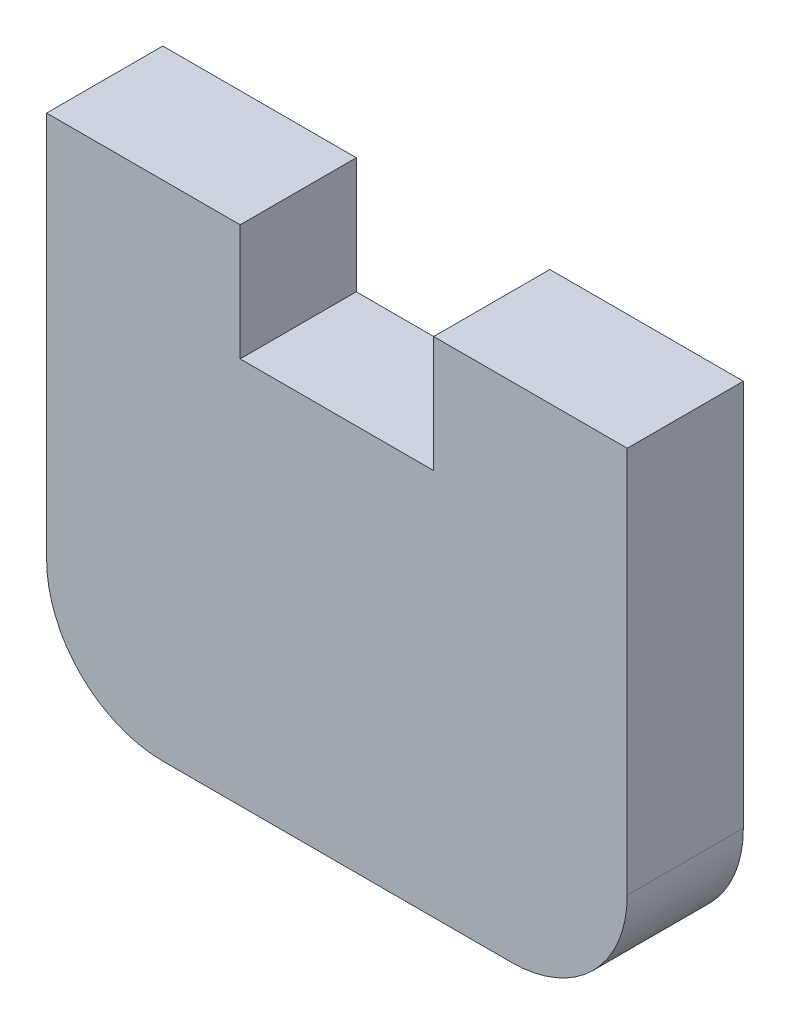
ISO-10303-21;
HEADER;
FILE_DESCRIPTION(('STEP AP214'),'2;1');
FILE_NAME('part.step','',(''),(''),'','','');
FILE_SCHEMA(('AUTOMOTIVE_DESIGN { 1 0 10303 214 1 1 1 1 }'));
ENDSEC;
DATA;
#1=APPLICATION_CONTEXT('core data for automotive mechanical design processes');
#2=APPLICATION_PROTOCOL_DEFINITION('international standard','automotive_design',2000,#1);
#3=PRODUCT_CONTEXT('',#1,'mechanical');
#4=PRODUCT('Part','Part','',(#3));
#5=PRODUCT_RELATED_PRODUCT_CATEGORY('part','',(#4));
#6=PRODUCT_DEFINITION_FORMATION('','',#4);
#7=PRODUCT_DEFINITION_CONTEXT('part definition',#1,'design');
#8=PRODUCT_DEFINITION('design','',#6,#7);
#9=PRODUCT_DEFINITION_SHAPE('','',#8);
#10=(LENGTH_UNIT() NAMED_UNIT(*) SI_UNIT(.MILLI.,.METRE.));
#11=(NAMED_UNIT(*) PLANE_ANGLE_UNIT() SI_UNIT($,.RADIAN.));
#12=(NAMED_UNIT(*) SI_UNIT($,.STERADIAN.) SOLID_ANGLE_UNIT());
#13=UNCERTAINTY_MEASURE_WITH_UNIT(LENGTH_MEASURE(1.E-05),#10,'distance_accuracy_value','');
#14=(GEOMETRIC_REPRESENTATION_CONTEXT(3) GLOBAL_UNCERTAINTY_ASSIGNED_CONTEXT((#13)) GLOBAL_UNIT_ASSIGNED_CONTEXT((#10,
#11,#12)) REPRESENTATION_CONTEXT('',''));
#15=CARTESIAN_POINT('',(0.,0.,0.));
#16=DIRECTION('',(0.,0.,1.));
#17=DIRECTION('',(1.,0.,0.));
#18=AXIS2_PLACEMENT_3D('',#15,#16,#17);
#19=CARTESIAN_POINT('',(-2.,12.0010272230946,3.));
#20=DIRECTION('',(0.,0.,-1.));
#21=DIRECTION('',(-1.,0.,0.));
#22=AXIS2_PLACEMENT_3D('',#19,#20,#21);
#23=CYLINDRICAL_SURFACE('',#22,3.);
#24=CARTESIAN_POINT('',(-2.,12.0010272230946,0.));
#25=DIRECTION('',(0.,0.,1.));
#26=DIRECTION('',(1.,0.,0.));
#27=AXIS2_PLACEMENT_3D('',#24,#25,#26);
#28=CIRCLE('',#27,3.);
#29=CARTESIAN_POINT('',(-5.,12.0010272230946,0.));
#30=VERTEX_POINT('',#29);
#31=CARTESIAN_POINT('',(-1.99999999999998,9.00102722309465,0.));
#32=VERTEX_POINT('',#31);
#33=EDGE_CURVE('E141',#30,#32,#28,.T.);
#34=ORIENTED_EDGE('',*,*,#33,.T.);
#35=DIRECTION('',(0.,0.,-1.));
#36=VECTOR('',#35,1.);
#37=CARTESIAN_POINT('',(-1.99999999999998,9.00102722309465,3.));
#38=LINE('',#37,#36);
#39=CARTESIAN_POINT('',(-1.99999999999998,9.00102722309465,3.));
#40=VERTEX_POINT('',#39);
#41=EDGE_CURVE('E11',#40,#32,#38,.T.);
#42=ORIENTED_EDGE('',*,*,#41,.F.);
#43=CARTESIAN_POINT('',(-2.,12.0010272230946,3.));
#44=DIRECTION('',(0.,0.,1.));
#45=DIRECTION('',(1.,0.,0.));
#46=AXIS2_PLACEMENT_3D('',#43,#44,#45);
#47=CIRCLE('',#46,3.);
#48=CARTESIAN_POINT('',(-5.,12.0010272230946,3.));
#49=VERTEX_POINT('',#48);
#50=EDGE_CURVE('E160',#49,#40,#47,.T.);
#51=ORIENTED_EDGE('',*,*,#50,.F.);
#52=DIRECTION('',(0.,0.,-1.));
#53=VECTOR('',#52,1.);
#54=CARTESIAN_POINT('',(-5.,12.0010272230946,3.));
#55=LINE('',#54,#53);
#56=EDGE_CURVE('E137',#49,#30,#55,.T.);
#57=ORIENTED_EDGE('',*,*,#56,.T.);
#58=EDGE_LOOP('',(#34,#42,#51,#57));
#59=FACE_BOUND('',#58,.T.);
#60=ADVANCED_FACE('F33',(#59),#23,.T.);
#61=CARTESIAN_POINT('',(6.99999999999999,9.00102722309465,3.));
#62=DIRECTION('',(0.,1.,0.));
#63=DIRECTION('',(0.,0.,1.));
#64=AXIS2_PLACEMENT_3D('',#61,#62,#63);
#65=PLANE('',#64);
#66=DIRECTION('',(1.,0.,0.));
#67=VECTOR('',#66,1.);
#68=CARTESIAN_POINT('',(6.99999999999999,9.00102722309465,0.));
#69=LINE('',#68,#67);
#70=CARTESIAN_POINT('',(6.99999999999999,9.00102722309464,0.));
#71=VERTEX_POINT('',#70);
#72=EDGE_CURVE('E144',#32,#71,#69,.T.);
#73=ORIENTED_EDGE('',*,*,#72,.T.);
#74=DIRECTION('',(0.,0.,-1.));
#75=VECTOR('',#74,1.);
#76=CARTESIAN_POINT('',(6.99999999999999,9.00102722309464,3.));
#77=LINE('',#76,#75);
#78=CARTESIAN_POINT('',(6.99999999999999,9.00102722309464,3.));
#79=VERTEX_POINT('',#78);
#80=EDGE_CURVE('E41',#79,#71,#77,.T.);
#81=ORIENTED_EDGE('',*,*,#80,.F.);
#82=DIRECTION('',(1.,0.,0.));
#83=VECTOR('',#82,1.);
#84=CARTESIAN_POINT('',(6.99999999999999,9.00102722309465,3.));
#85=LINE('',#84,#83);
#86=EDGE_CURVE('E98',#40,#79,#85,.T.);
#87=ORIENTED_EDGE('',*,*,#86,.F.);
#88=ORIENTED_EDGE('',*,*,#41,.T.);
#89=EDGE_LOOP('',(#73,#81,#87,#88));
#90=FACE_BOUND('',#89,.T.);
#91=ADVANCED_FACE('F208',(#90),#65,.F.);
#92=CARTESIAN_POINT('',(6.99999999999999,12.0010272230946,3.));
#93=DIRECTION('',(0.,0.,-1.));
#94=DIRECTION('',(-1.,0.,0.));
#95=AXIS2_PLACEMENT_3D('',#92,#93,#94);
#96=CYLINDRICAL_SURFACE('',#95,3.);
#97=CARTESIAN_POINT('',(6.99999999999999,12.0010272230946,0.));
#98=DIRECTION('',(0.,0.,1.));
#99=DIRECTION('',(-1.,0.,0.));
#100=AXIS2_PLACEMENT_3D('',#97,#98,#99);
#101=CIRCLE('',#100,3.);
#102=CARTESIAN_POINT('',(9.99999999999999,12.0010272230946,0.));
#103=VERTEX_POINT('',#102);
#104=EDGE_CURVE('E146',#71,#103,#101,.T.);
#105=ORIENTED_EDGE('',*,*,#104,.T.);
#106=DIRECTION('',(0.,0.,-1.));
#107=VECTOR('',#106,1.);
#108=CARTESIAN_POINT('',(9.99999999999999,12.0010272230946,3.));
#109=LINE('',#108,#107);
#110=CARTESIAN_POINT('',(9.99999999999999,12.0010272230946,3.));
#111=VERTEX_POINT('',#110);
#112=EDGE_CURVE('E173',#111,#103,#109,.T.);
#113=ORIENTED_EDGE('',*,*,#112,.F.);
#114=CARTESIAN_POINT('',(6.99999999999999,12.0010272230946,3.));
#115=DIRECTION('',(0.,0.,1.));
#116=DIRECTION('',(-1.,0.,0.));
#117=AXIS2_PLACEMENT_3D('',#114,#115,#116);
#118=CIRCLE('',#117,3.);
#119=EDGE_CURVE('E181',#79,#111,#118,.T.);
#120=ORIENTED_EDGE('',*,*,#119,.F.);
#121=ORIENTED_EDGE('',*,*,#80,.T.);
#122=EDGE_LOOP('',(#105,#113,#120,#121));
#123=FACE_BOUND('',#122,.T.);
#124=ADVANCED_FACE('F179',(#123),#96,.T.);
#125=CARTESIAN_POINT('',(9.99999999999999,19.0010272230946,3.));
#126=DIRECTION('',(-1.,0.,0.));
#127=DIRECTION('',(0.,0.,1.));
#128=AXIS2_PLACEMENT_3D('',#125,#126,#127);
#129=PLANE('',#128);
#130=DIRECTION('',(0.,1.,0.));
#131=VECTOR('',#130,1.);
#132=CARTESIAN_POINT('',(9.99999999999999,19.0010272230946,0.));
#133=LINE('',#132,#131);
#134=CARTESIAN_POINT('',(9.99999999999999,22.0010272230946,0.));
#135=VERTEX_POINT('',#134);
#136=EDGE_CURVE('E149',#103,#135,#133,.T.);
#137=ORIENTED_EDGE('',*,*,#136,.T.);
#138=DIRECTION('',(0.,0.,-1.));
#139=VECTOR('',#138,1.);
#140=CARTESIAN_POINT('',(9.99999999999999,22.0010272230946,3.));
#141=LINE('',#140,#139);
#142=CARTESIAN_POINT('',(9.99999999999999,22.0010272230946,3.));
#143=VERTEX_POINT('',#142);
#144=EDGE_CURVE('E170',#143,#135,#141,.T.);
#145=ORIENTED_EDGE('',*,*,#144,.F.);
#146=DIRECTION('',(0.,1.,0.));
#147=VECTOR('',#146,1.);
#148=CARTESIAN_POINT('',(9.99999999999999,19.0010272230946,3.));
#149=LINE('',#148,#147);
#150=EDGE_CURVE('E198',#111,#143,#149,.T.);
#151=ORIENTED_EDGE('',*,*,#150,.F.);
#152=ORIENTED_EDGE('',*,*,#112,.T.);
#153=EDGE_LOOP('',(#137,#145,#151,#152));
#154=FACE_BOUND('',#153,.T.);
#155=ADVANCED_FACE('F189',(#154),#129,.F.);
#156=CARTESIAN_POINT('',(9.99999999999999,22.0010272230946,3.));
#157=DIRECTION('',(0.,-1.,0.));
#158=DIRECTION('',(0.,0.,-1.));
#159=AXIS2_PLACEMENT_3D('',#156,#157,#158);
#160=PLANE('',#159);
#161=DIRECTION('',(-1.,0.,0.));
#162=VECTOR('',#161,1.);
#163=CARTESIAN_POINT('',(9.99999999999999,22.0010272230946,0.));
#164=LINE('',#163,#162);
#165=CARTESIAN_POINT('',(4.99999999999999,22.0010272230946,0.));
#166=VERTEX_POINT('',#165);
#167=EDGE_CURVE('E151',#135,#166,#164,.T.);
#168=ORIENTED_EDGE('',*,*,#167,.T.);
#169=DIRECTION('',(0.,0.,-1.));
#170=VECTOR('',#169,1.);
#171=CARTESIAN_POINT('',(4.99999999999999,22.0010272230946,3.));
#172=LINE('',#171,#170);
#173=CARTESIAN_POINT('',(4.99999999999999,22.0010272230946,3.));
#174=VERTEX_POINT('',#173);
#175=EDGE_CURVE('E167',#174,#166,#172,.T.);
#176=ORIENTED_EDGE('',*,*,#175,.F.);
#177=DIRECTION('',(-1.,0.,0.));
#178=VECTOR('',#177,1.);
#179=CARTESIAN_POINT('',(9.99999999999999,22.0010272230946,3.));
#180=LINE('',#179,#178);
#181=EDGE_CURVE('E195',#143,#174,#180,.T.);
#182=ORIENTED_EDGE('',*,*,#181,.F.);
#183=ORIENTED_EDGE('',*,*,#144,.T.);
#184=EDGE_LOOP('',(#168,#176,#182,#183));
#185=FACE_BOUND('',#184,.T.);
#186=ADVANCED_FACE('F193',(#185),#160,.F.);
#187=CARTESIAN_POINT('',(4.99999999999999,22.0010272230946,3.));
#188=DIRECTION('',(1.,0.,0.));
#189=DIRECTION('',(0.,0.,-1.));
#190=AXIS2_PLACEMENT_3D('',#187,#188,#189);
#191=PLANE('',#190);
#192=DIRECTION('',(0.,-1.,0.));
#193=VECTOR('',#192,1.);
#194=CARTESIAN_POINT('',(4.99999999999999,22.0010272230946,0.));
#195=LINE('',#194,#193);
#196=CARTESIAN_POINT('',(4.99999999999999,19.0010272230946,0.));
#197=VERTEX_POINT('',#196);
#198=EDGE_CURVE('E153',#166,#197,#195,.T.);
#199=ORIENTED_EDGE('',*,*,#198,.T.);
#200=DIRECTION('',(0.,0.,-1.));
#201=VECTOR('',#200,1.);
#202=CARTESIAN_POINT('',(4.99999999999999,19.0010272230946,3.));
#203=LINE('',#202,#201);
#204=CARTESIAN_POINT('',(4.99999999999999,19.0010272230946,3.));
#205=VERTEX_POINT('',#204);
#206=EDGE_CURVE('E164',#205,#197,#203,.T.);
#207=ORIENTED_EDGE('',*,*,#206,.F.);
#208=DIRECTION('',(0.,-1.,0.));
#209=VECTOR('',#208,1.);
#210=CARTESIAN_POINT('',(4.99999999999999,22.0010272230946,3.));
#211=LINE('',#210,#209);
#212=EDGE_CURVE('E197',#174,#205,#211,.T.);
#213=ORIENTED_EDGE('',*,*,#212,.F.);
#214=ORIENTED_EDGE('',*,*,#175,.T.);
#215=EDGE_LOOP('',(#199,#207,#213,#214));
#216=FACE_BOUND('',#215,.T.);
#217=ADVANCED_FACE('F220',(#216),#191,.F.);
#218=CARTESIAN_POINT('',(4.99999999999999,19.0010272230946,3.));
#219=DIRECTION('',(0.,-1.,0.));
#220=DIRECTION('',(1.,0.,0.));
#221=AXIS2_PLACEMENT_3D('',#218,#219,#220);
#222=PLANE('',#221);
#223=DIRECTION('',(-1.,0.,0.));
#224=VECTOR('',#223,1.);
#225=CARTESIAN_POINT('',(4.99999999999999,19.0010272230946,0.));
#226=LINE('',#225,#224);
#227=CARTESIAN_POINT('',(0.,19.0010272230946,0.));
#228=VERTEX_POINT('',#227);
#229=EDGE_CURVE('E155',#197,#228,#226,.T.);
#230=ORIENTED_EDGE('',*,*,#229,.T.);
#231=DIRECTION('',(0.,0.,-1.));
#232=VECTOR('',#231,1.);
#233=CARTESIAN_POINT('',(0.,19.0010272230946,3.));
#234=LINE('',#233,#232);
#235=CARTESIAN_POINT('',(0.,19.0010272230946,3.));
#236=VERTEX_POINT('',#235);
#237=EDGE_CURVE('E132',#236,#228,#234,.T.);
#238=ORIENTED_EDGE('',*,*,#237,.F.);
#239=DIRECTION('',(-1.,0.,0.));
#240=VECTOR('',#239,1.);
#241=CARTESIAN_POINT('',(4.99999999999999,19.0010272230946,3.));
#242=LINE('',#241,#240);
#243=EDGE_CURVE('E123',#205,#236,#242,.T.);
#244=ORIENTED_EDGE('',*,*,#243,.F.);
#245=ORIENTED_EDGE('',*,*,#206,.T.);
#246=EDGE_LOOP('',(#230,#238,#244,#245));
#247=FACE_BOUND('',#246,.T.);
#248=ADVANCED_FACE('F223',(#247),#222,.F.);
#249=CARTESIAN_POINT('',(0.,19.0010272230946,3.));
#250=DIRECTION('',(-1.,0.,0.));
#251=DIRECTION('',(0.,0.,1.));
#252=AXIS2_PLACEMENT_3D('',#249,#250,#251);
#253=PLANE('',#252);
#254=DIRECTION('',(0.,1.,0.));
#255=VECTOR('',#254,1.);
#256=CARTESIAN_POINT('',(0.,19.0010272230946,0.));
#257=LINE('',#256,#255);
#258=CARTESIAN_POINT('',(0.,22.0010272230946,0.));
#259=VERTEX_POINT('',#258);
#260=EDGE_CURVE('E131',#228,#259,#257,.T.);
#261=ORIENTED_EDGE('',*,*,#260,.T.);
#262=DIRECTION('',(0.,0.,-1.));
#263=VECTOR('',#262,1.);
#264=CARTESIAN_POINT('',(0.,22.0010272230946,3.));
#265=LINE('',#264,#263);
#266=CARTESIAN_POINT('',(0.,22.0010272230946,3.));
#267=VERTEX_POINT('',#266);
#268=EDGE_CURVE('E128',#267,#259,#265,.T.);
#269=ORIENTED_EDGE('',*,*,#268,.F.);
#270=DIRECTION('',(0.,1.,0.));
#271=VECTOR('',#270,1.);
#272=CARTESIAN_POINT('',(0.,19.0010272230946,3.));
#273=LINE('',#272,#271);
#274=EDGE_CURVE('E117',#236,#267,#273,.T.);
#275=ORIENTED_EDGE('',*,*,#274,.F.);
#276=ORIENTED_EDGE('',*,*,#237,.T.);
#277=EDGE_LOOP('',(#261,#269,#275,#276));
#278=FACE_BOUND('',#277,.T.);
#279=ADVANCED_FACE('F129',(#278),#253,.F.);
#280=CARTESIAN_POINT('',(0.,22.0010272230946,3.));
#281=DIRECTION('',(0.,-1.,0.));
#282=DIRECTION('',(0.,0.,-1.));
#283=AXIS2_PLACEMENT_3D('',#280,#281,#282);
#284=PLANE('',#283);
#285=DIRECTION('',(-1.,0.,0.));
#286=VECTOR('',#285,1.);
#287=CARTESIAN_POINT('',(0.,22.0010272230946,0.));
#288=LINE('',#287,#286);
#289=CARTESIAN_POINT('',(-5.,22.0010272230946,0.));
#290=VERTEX_POINT('',#289);
#291=EDGE_CURVE('E84',#259,#290,#288,.T.);
#292=ORIENTED_EDGE('',*,*,#291,.T.);
#293=DIRECTION('',(0.,0.,-1.));
#294=VECTOR('',#293,1.);
#295=CARTESIAN_POINT('',(-5.,22.0010272230946,3.));
#296=LINE('',#295,#294);
#297=CARTESIAN_POINT('',(-5.,22.0010272230946,3.));
#298=VERTEX_POINT('',#297);
#299=EDGE_CURVE('E133',#298,#290,#296,.T.);
#300=ORIENTED_EDGE('',*,*,#299,.F.);
#301=DIRECTION('',(-1.,0.,0.));
#302=VECTOR('',#301,1.);
#303=CARTESIAN_POINT('',(0.,22.0010272230946,3.));
#304=LINE('',#303,#302);
#305=EDGE_CURVE('E121',#267,#298,#304,.T.);
#306=ORIENTED_EDGE('',*,*,#305,.F.);
#307=ORIENTED_EDGE('',*,*,#268,.T.);
#308=EDGE_LOOP('',(#292,#300,#306,#307));
#309=FACE_BOUND('',#308,.T.);
#310=ADVANCED_FACE('F135',(#309),#284,.F.);
#311=CARTESIAN_POINT('',(-5.,22.0010272230946,3.));
#312=DIRECTION('',(1.,0.,0.));
#313=DIRECTION('',(0.,1.,0.));
#314=AXIS2_PLACEMENT_3D('',#311,#312,#313);
#315=PLANE('',#314);
#316=DIRECTION('',(0.,-1.,0.));
#317=VECTOR('',#316,1.);
#318=CARTESIAN_POINT('',(-5.,22.0010272230946,0.));
#319=LINE('',#318,#317);
#320=EDGE_CURVE('E90',#290,#30,#319,.T.);
#321=ORIENTED_EDGE('',*,*,#320,.T.);
#322=ORIENTED_EDGE('',*,*,#56,.F.);
#323=DIRECTION('',(0.,-1.,0.));
#324=VECTOR('',#323,1.);
#325=CARTESIAN_POINT('',(-5.,22.0010272230946,3.));
#326=LINE('',#325,#324);
#327=EDGE_CURVE('E49',#298,#49,#326,.T.);
#328=ORIENTED_EDGE('',*,*,#327,.F.);
#329=ORIENTED_EDGE('',*,*,#299,.T.);
#330=EDGE_LOOP('',(#321,#322,#328,#329));
#331=FACE_BOUND('',#330,.T.);
#332=ADVANCED_FACE('F232',(#331),#315,.F.);
#333=CARTESIAN_POINT('',(-2.,12.0010272230946,3.));
#334=DIRECTION('',(0.,0.,1.));
#335=DIRECTION('',(1.,0.,0.));
#336=AXIS2_PLACEMENT_3D('',#333,#334,#335);
#337=PLANE('',#336);
#338=ORIENTED_EDGE('',*,*,#50,.T.);
#339=ORIENTED_EDGE('',*,*,#86,.T.);
#340=ORIENTED_EDGE('',*,*,#119,.T.);
#341=ORIENTED_EDGE('',*,*,#150,.T.);
#342=ORIENTED_EDGE('',*,*,#181,.T.);
#343=ORIENTED_EDGE('',*,*,#212,.T.);
#344=ORIENTED_EDGE('',*,*,#243,.T.);
#345=ORIENTED_EDGE('',*,*,#274,.T.);
#346=ORIENTED_EDGE('',*,*,#305,.T.);
#347=ORIENTED_EDGE('',*,*,#327,.T.);
#348=EDGE_LOOP('',(#338,#339,#340,#341,#342,#343,#344,#345,#346,#347));
#349=FACE_BOUND('',#348,.T.);
#350=ADVANCED_FACE('F119',(#349),#337,.T.);
#351=CARTESIAN_POINT('',(-2.,12.0010272230946,0.));
#352=DIRECTION('',(0.,0.,1.));
#353=DIRECTION('',(1.,0.,0.));
#354=AXIS2_PLACEMENT_3D('',#351,#352,#353);
#355=PLANE('',#354);
#356=ORIENTED_EDGE('',*,*,#33,.F.);
#357=ORIENTED_EDGE('',*,*,#320,.F.);
#358=ORIENTED_EDGE('',*,*,#291,.F.);
#359=ORIENTED_EDGE('',*,*,#260,.F.);
#360=ORIENTED_EDGE('',*,*,#229,.F.);
#361=ORIENTED_EDGE('',*,*,#198,.F.);
#362=ORIENTED_EDGE('',*,*,#167,.F.);
#363=ORIENTED_EDGE('',*,*,#136,.F.);
#364=ORIENTED_EDGE('',*,*,#104,.F.);
#365=ORIENTED_EDGE('',*,*,#72,.F.);
#366=EDGE_LOOP('',(#356,#357,#358,#359,#360,#361,#362,#363,#364,#365));
#367=FACE_BOUND('',#366,.T.);
#368=ADVANCED_FACE('F184',(#367),#355,.F.);
#369=CLOSED_SHELL('',(#60,#91,#124,#155,#186,#217,#248,#279,#310,#332,#350,#368));
#370=MANIFOLD_SOLID_BREP('B2',#369);
#371=ADVANCED_BREP_SHAPE_REPRESENTATION('',(#18,#370),#14);
#372=SHAPE_DEFINITION_REPRESENTATION(#9,#371);
ENDSEC;
END-ISO-10303-21;
